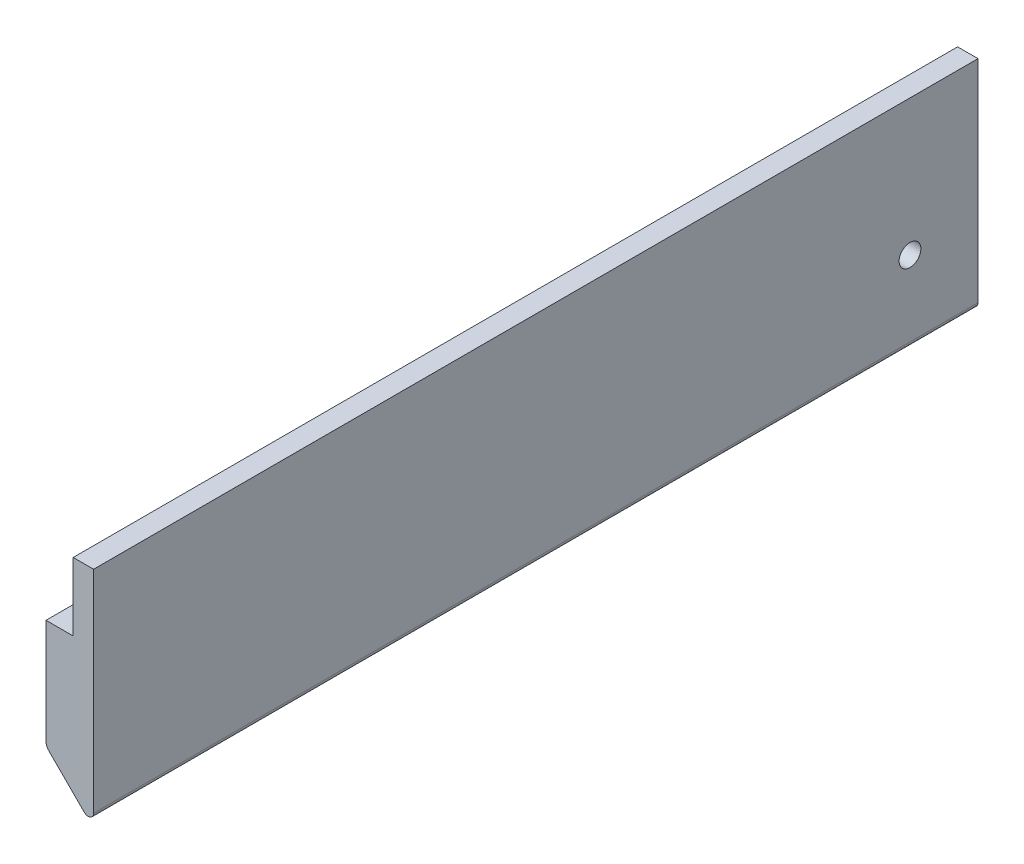
ISO-10303-21;
HEADER;
FILE_DESCRIPTION(('STEP AP214'),'2;1');
FILE_NAME('part.step','',(''),(''),'','','');
FILE_SCHEMA(('AUTOMOTIVE_DESIGN { 1 0 10303 214 1 1 1 1 }'));
ENDSEC;
DATA;
#1=APPLICATION_CONTEXT('core data for automotive mechanical design processes');
#2=APPLICATION_PROTOCOL_DEFINITION('international standard','automotive_design',2000,#1);
#3=PRODUCT_CONTEXT('',#1,'mechanical');
#4=PRODUCT('Part','Part','',(#3));
#5=PRODUCT_RELATED_PRODUCT_CATEGORY('part','',(#4));
#6=PRODUCT_DEFINITION_FORMATION('','',#4);
#7=PRODUCT_DEFINITION_CONTEXT('part definition',#1,'design');
#8=PRODUCT_DEFINITION('design','',#6,#7);
#9=PRODUCT_DEFINITION_SHAPE('','',#8);
#10=(LENGTH_UNIT() NAMED_UNIT(*) SI_UNIT(.MILLI.,.METRE.));
#11=(NAMED_UNIT(*) PLANE_ANGLE_UNIT() SI_UNIT($,.RADIAN.));
#12=(NAMED_UNIT(*) SI_UNIT($,.STERADIAN.) SOLID_ANGLE_UNIT());
#13=UNCERTAINTY_MEASURE_WITH_UNIT(LENGTH_MEASURE(1.E-05),#10,'distance_accuracy_value','');
#14=(GEOMETRIC_REPRESENTATION_CONTEXT(3) GLOBAL_UNCERTAINTY_ASSIGNED_CONTEXT((#13)) GLOBAL_UNIT_ASSIGNED_CONTEXT((#10,
#11,#12)) REPRESENTATION_CONTEXT('',''));
#15=CARTESIAN_POINT('',(0.,0.,0.));
#16=DIRECTION('',(0.,0.,1.));
#17=DIRECTION('',(1.,0.,0.));
#18=AXIS2_PLACEMENT_3D('',#15,#16,#17);
#19=CARTESIAN_POINT('',(-7.01000000000001,30.,150.));
#20=DIRECTION('',(0.,0.,1.));
#21=DIRECTION('',(1.,0.,0.));
#22=AXIS2_PLACEMENT_3D('',#19,#20,#21);
#23=PLANE('',#22);
#24=CARTESIAN_POINT('',(-0.8,-1.06862915010153,150.));
#25=DIRECTION('',(0.,0.,1.));
#26=DIRECTION('',(1.,0.,0.));
#27=AXIS2_PLACEMENT_3D('',#24,#25,#26);
#28=CIRCLE('',#27,0.8);
#29=CARTESIAN_POINT('',(0.,-1.06862915010152,150.));
#30=VERTEX_POINT('',#29);
#31=CARTESIAN_POINT('',(-1.36568542494924,-1.63431457505076,150.));
#32=VERTEX_POINT('',#31);
#33=EDGE_CURVE('E155',#30,#32,#28,.F.);
#34=ORIENTED_EDGE('',*,*,#33,.F.);
#35=DIRECTION('',(0.,-1.,0.));
#36=VECTOR('',#35,1.);
#37=CARTESIAN_POINT('',(0.,0.,150.));
#38=LINE('',#37,#36);
#39=CARTESIAN_POINT('',(0.,30.,150.));
#40=VERTEX_POINT('',#39);
#41=EDGE_CURVE('E162',#40,#30,#38,.T.);
#42=ORIENTED_EDGE('',*,*,#41,.F.);
#43=DIRECTION('',(1.,0.,0.));
#44=VECTOR('',#43,1.);
#45=CARTESIAN_POINT('',(0.,30.,150.));
#46=LINE('',#45,#44);
#47=CARTESIAN_POINT('',(-3.,30.,150.));
#48=VERTEX_POINT('',#47);
#49=EDGE_CURVE('E117',#48,#40,#46,.T.);
#50=ORIENTED_EDGE('',*,*,#49,.F.);
#51=DIRECTION('',(0.,1.,0.));
#52=VECTOR('',#51,1.);
#53=CARTESIAN_POINT('',(-3.,20.,150.));
#54=LINE('',#53,#52);
#55=CARTESIAN_POINT('',(-3.,20.,150.));
#56=VERTEX_POINT('',#55);
#57=EDGE_CURVE('E107',#56,#48,#54,.T.);
#58=ORIENTED_EDGE('',*,*,#57,.F.);
#59=DIRECTION('',(-1.,0.,0.));
#60=VECTOR('',#59,1.);
#61=CARTESIAN_POINT('',(-7.,20.,150.));
#62=LINE('',#61,#60);
#63=CARTESIAN_POINT('',(-7.,20.,150.));
#64=VERTEX_POINT('',#63);
#65=EDGE_CURVE('E115',#56,#64,#62,.T.);
#66=ORIENTED_EDGE('',*,*,#65,.T.);
#67=DIRECTION('',(0.,1.,0.));
#68=VECTOR('',#67,1.);
#69=CARTESIAN_POINT('',(-7.,7.,150.));
#70=LINE('',#69,#68);
#71=CARTESIAN_POINT('',(-7.,4.62132034355964,150.));
#72=VERTEX_POINT('',#71);
#73=EDGE_CURVE('E118',#72,#64,#70,.T.);
#74=ORIENTED_EDGE('',*,*,#73,.F.);
#75=CARTESIAN_POINT('',(-5.5,4.62132034355964,150.));
#76=DIRECTION('',(0.,0.,1.));
#77=DIRECTION('',(1.,0.,0.));
#78=AXIS2_PLACEMENT_3D('',#75,#76,#77);
#79=CIRCLE('',#78,1.5);
#80=CARTESIAN_POINT('',(-6.56066017177982,3.56066017177982,150.));
#81=VERTEX_POINT('',#80);
#82=EDGE_CURVE('E157',#81,#72,#79,.F.);
#83=ORIENTED_EDGE('',*,*,#82,.F.);
#84=DIRECTION('',(-0.707106781186548,0.707106781186548,0.));
#85=VECTOR('',#84,1.);
#86=CARTESIAN_POINT('',(-7.,4.,150.));
#87=LINE('',#86,#85);
#88=EDGE_CURVE('E159',#32,#81,#87,.T.);
#89=ORIENTED_EDGE('',*,*,#88,.F.);
#90=EDGE_LOOP('',(#34,#42,#50,#58,#66,#74,#83,#89));
#91=FACE_BOUND('',#90,.T.);
#92=ADVANCED_FACE('F41',(#91),#23,.T.);
#93=CARTESIAN_POINT('',(-3.,20.,20.));
#94=DIRECTION('',(-1.,0.,0.));
#95=DIRECTION('',(0.,0.,1.));
#96=AXIS2_PLACEMENT_3D('',#93,#94,#95);
#97=PLANE('',#96);
#98=DIRECTION('',(0.,0.,-1.));
#99=VECTOR('',#98,1.);
#100=CARTESIAN_POINT('',(-3.,20.,280.));
#101=LINE('',#100,#99);
#102=CARTESIAN_POINT('',(-3.,20.,20.));
#103=VERTEX_POINT('',#102);
#104=EDGE_CURVE('E45',#56,#103,#101,.T.);
#105=ORIENTED_EDGE('',*,*,#104,.F.);
#106=ORIENTED_EDGE('',*,*,#57,.T.);
#107=DIRECTION('',(0.,0.,1.));
#108=VECTOR('',#107,1.);
#109=CARTESIAN_POINT('',(-3.,30.,20.));
#110=LINE('',#109,#108);
#111=CARTESIAN_POINT('',(-3.,30.,20.));
#112=VERTEX_POINT('',#111);
#113=EDGE_CURVE('E139',#112,#48,#110,.T.);
#114=ORIENTED_EDGE('',*,*,#113,.F.);
#115=DIRECTION('',(0.,-1.,0.));
#116=VECTOR('',#115,1.);
#117=CARTESIAN_POINT('',(-3.,20.,20.));
#118=LINE('',#117,#116);
#119=EDGE_CURVE('E109',#112,#103,#118,.T.);
#120=ORIENTED_EDGE('',*,*,#119,.T.);
#121=EDGE_LOOP('',(#105,#106,#114,#120));
#122=FACE_BOUND('',#121,.T.);
#123=ADVANCED_FACE('F105',(#122),#97,.T.);
#124=CARTESIAN_POINT('',(-7.,7.,20.));
#125=DIRECTION('',(-1.,0.,0.));
#126=DIRECTION('',(0.,0.,1.));
#127=AXIS2_PLACEMENT_3D('',#124,#125,#126);
#128=PLANE('',#127);
#129=CARTESIAN_POINT('',(-7.,10.,30.));
#130=DIRECTION('',(-1.,0.,0.));
#131=DIRECTION('',(0.,0.,1.));
#132=AXIS2_PLACEMENT_3D('',#129,#130,#131);
#133=CIRCLE('',#132,3.36);
#134=CARTESIAN_POINT('',(-7.,10.,33.36));
#135=VERTEX_POINT('',#134);
#136=EDGE_CURVE('E11',#135,#135,#133,.T.);
#137=ORIENTED_EDGE('',*,*,#136,.F.);
#138=EDGE_LOOP('',(#137));
#139=FACE_BOUND('',#138,.T.);
#140=DIRECTION('',(0.,0.,1.));
#141=VECTOR('',#140,1.);
#142=CARTESIAN_POINT('',(-7.,4.62132034355964,20.));
#143=LINE('',#142,#141);
#144=CARTESIAN_POINT('',(-7.,4.62132034355964,20.));
#145=VERTEX_POINT('',#144);
#146=EDGE_CURVE('E134',#145,#72,#143,.T.);
#147=ORIENTED_EDGE('',*,*,#146,.T.);
#148=ORIENTED_EDGE('',*,*,#73,.T.);
#149=DIRECTION('',(0.,0.,-1.));
#150=VECTOR('',#149,1.);
#151=CARTESIAN_POINT('',(-7.,20.,280.));
#152=LINE('',#151,#150);
#153=CARTESIAN_POINT('',(-7.,20.,20.));
#154=VERTEX_POINT('',#153);
#155=EDGE_CURVE('E111',#64,#154,#152,.T.);
#156=ORIENTED_EDGE('',*,*,#155,.T.);
#157=DIRECTION('',(0.,-1.,0.));
#158=VECTOR('',#157,1.);
#159=CARTESIAN_POINT('',(-7.,7.,20.));
#160=LINE('',#159,#158);
#161=EDGE_CURVE('E183',#154,#145,#160,.T.);
#162=ORIENTED_EDGE('',*,*,#161,.T.);
#163=EDGE_LOOP('',(#147,#148,#156,#162));
#164=FACE_BOUND('',#163,.T.);
#165=ADVANCED_FACE('F164',(#139,#164),#128,.T.);
#166=CARTESIAN_POINT('',(0.,0.,20.));
#167=DIRECTION('',(1.,0.,0.));
#168=DIRECTION('',(0.,1.,0.));
#169=AXIS2_PLACEMENT_3D('',#166,#167,#168);
#170=PLANE('',#169);
#171=CARTESIAN_POINT('',(0.,10.,30.));
#172=DIRECTION('',(-1.,0.,0.));
#173=DIRECTION('',(0.,0.,1.));
#174=AXIS2_PLACEMENT_3D('',#171,#172,#173);
#175=CIRCLE('',#174,1.6);
#176=CARTESIAN_POINT('',(0.,10.,31.6));
#177=VERTEX_POINT('',#176);
#178=EDGE_CURVE('E110',#177,#177,#175,.T.);
#179=ORIENTED_EDGE('',*,*,#178,.T.);
#180=EDGE_LOOP('',(#179));
#181=FACE_BOUND('',#180,.T.);
#182=DIRECTION('',(0.,0.,-1.));
#183=VECTOR('',#182,1.);
#184=CARTESIAN_POINT('',(0.,30.,280.));
#185=LINE('',#184,#183);
#186=CARTESIAN_POINT('',(0.,30.,20.));
#187=VERTEX_POINT('',#186);
#188=EDGE_CURVE('E137',#40,#187,#185,.T.);
#189=ORIENTED_EDGE('',*,*,#188,.F.);
#190=ORIENTED_EDGE('',*,*,#41,.T.);
#191=DIRECTION('',(0.,0.,-1.));
#192=VECTOR('',#191,1.);
#193=CARTESIAN_POINT('',(0.,-1.06862915010152,20.));
#194=LINE('',#193,#192);
#195=CARTESIAN_POINT('',(0.,-1.06862915010152,20.));
#196=VERTEX_POINT('',#195);
#197=EDGE_CURVE('E129',#30,#196,#194,.T.);
#198=ORIENTED_EDGE('',*,*,#197,.T.);
#199=DIRECTION('',(0.,1.,0.));
#200=VECTOR('',#199,1.);
#201=CARTESIAN_POINT('',(0.,0.,20.));
#202=LINE('',#201,#200);
#203=EDGE_CURVE('E179',#196,#187,#202,.T.);
#204=ORIENTED_EDGE('',*,*,#203,.T.);
#205=EDGE_LOOP('',(#189,#190,#198,#204));
#206=FACE_BOUND('',#205,.T.);
#207=ADVANCED_FACE('F193',(#181,#206),#170,.T.);
#208=CARTESIAN_POINT('',(-7.,4.,20.));
#209=DIRECTION('',(-0.707106781186548,-0.707106781186548,0.));
#210=DIRECTION('',(0.707106781186548,-0.707106781186548,0.));
#211=AXIS2_PLACEMENT_3D('',#208,#209,#210);
#212=PLANE('',#211);
#213=DIRECTION('',(0.,0.,-1.));
#214=VECTOR('',#213,1.);
#215=CARTESIAN_POINT('',(-1.36568542494924,-1.63431457505076,20.));
#216=LINE('',#215,#214);
#217=CARTESIAN_POINT('',(-1.36568542494924,-1.63431457505076,20.));
#218=VERTEX_POINT('',#217);
#219=EDGE_CURVE('E125',#218,#32,#216,.F.);
#220=ORIENTED_EDGE('',*,*,#219,.T.);
#221=ORIENTED_EDGE('',*,*,#88,.T.);
#222=DIRECTION('',(0.,0.,1.));
#223=VECTOR('',#222,1.);
#224=CARTESIAN_POINT('',(-6.56066017177982,3.56066017177982,20.));
#225=LINE('',#224,#223);
#226=CARTESIAN_POINT('',(-6.56066017177982,3.56066017177982,20.));
#227=VERTEX_POINT('',#226);
#228=EDGE_CURVE('E132',#81,#227,#225,.F.);
#229=ORIENTED_EDGE('',*,*,#228,.T.);
#230=DIRECTION('',(0.707106781186548,-0.707106781186548,0.));
#231=VECTOR('',#230,1.);
#232=CARTESIAN_POINT('',(-7.,4.,20.));
#233=LINE('',#232,#231);
#234=EDGE_CURVE('E182',#227,#218,#233,.T.);
#235=ORIENTED_EDGE('',*,*,#234,.T.);
#236=EDGE_LOOP('',(#220,#221,#229,#235));
#237=FACE_BOUND('',#236,.T.);
#238=ADVANCED_FACE('F170',(#237),#212,.T.);
#239=CARTESIAN_POINT('',(-5.5,4.62132034355964,20.));
#240=DIRECTION('',(0.,0.,1.));
#241=DIRECTION('',(1.,0.,0.));
#242=AXIS2_PLACEMENT_3D('',#239,#240,#241);
#243=CYLINDRICAL_SURFACE('',#242,1.5);
#244=ORIENTED_EDGE('',*,*,#228,.F.);
#245=ORIENTED_EDGE('',*,*,#82,.T.);
#246=ORIENTED_EDGE('',*,*,#146,.F.);
#247=CARTESIAN_POINT('',(-5.5,4.62132034355964,20.));
#248=DIRECTION('',(0.,0.,1.));
#249=DIRECTION('',(1.,0.,0.));
#250=AXIS2_PLACEMENT_3D('',#247,#248,#249);
#251=CIRCLE('',#250,1.5);
#252=EDGE_CURVE('E131',#227,#145,#251,.F.);
#253=ORIENTED_EDGE('',*,*,#252,.F.);
#254=EDGE_LOOP('',(#244,#245,#246,#253));
#255=FACE_BOUND('',#254,.T.);
#256=ADVANCED_FACE('F43',(#255),#243,.T.);
#257=CARTESIAN_POINT('',(-0.8,-1.06862915010153,20.));
#258=DIRECTION('',(0.,0.,-1.));
#259=DIRECTION('',(-1.,0.,0.));
#260=AXIS2_PLACEMENT_3D('',#257,#258,#259);
#261=CYLINDRICAL_SURFACE('',#260,0.8);
#262=ORIENTED_EDGE('',*,*,#197,.F.);
#263=ORIENTED_EDGE('',*,*,#33,.T.);
#264=ORIENTED_EDGE('',*,*,#219,.F.);
#265=CARTESIAN_POINT('',(-0.8,-1.06862915010153,20.));
#266=DIRECTION('',(0.,0.,1.));
#267=DIRECTION('',(1.,0.,0.));
#268=AXIS2_PLACEMENT_3D('',#265,#266,#267);
#269=CIRCLE('',#268,0.8);
#270=EDGE_CURVE('E128',#196,#218,#269,.F.);
#271=ORIENTED_EDGE('',*,*,#270,.F.);
#272=EDGE_LOOP('',(#262,#263,#264,#271));
#273=FACE_BOUND('',#272,.T.);
#274=ADVANCED_FACE('F196',(#273),#261,.T.);
#275=CARTESIAN_POINT('',(0.,30.,0.));
#276=DIRECTION('',(0.,1.,0.));
#277=DIRECTION('',(0.,0.,1.));
#278=AXIS2_PLACEMENT_3D('',#275,#276,#277);
#279=PLANE('',#278);
#280=ORIENTED_EDGE('',*,*,#113,.T.);
#281=ORIENTED_EDGE('',*,*,#49,.T.);
#282=ORIENTED_EDGE('',*,*,#188,.T.);
#283=DIRECTION('',(-1.,0.,0.));
#284=VECTOR('',#283,1.);
#285=CARTESIAN_POINT('',(0.,30.,20.));
#286=LINE('',#285,#284);
#287=EDGE_CURVE('E140',#187,#112,#286,.T.);
#288=ORIENTED_EDGE('',*,*,#287,.T.);
#289=EDGE_LOOP('',(#280,#281,#282,#288));
#290=FACE_BOUND('',#289,.T.);
#291=ADVANCED_FACE('F187',(#290),#279,.T.);
#292=CARTESIAN_POINT('',(-7.,20.,280.));
#293=DIRECTION('',(0.,-1.,0.));
#294=DIRECTION('',(0.,0.,-1.));
#295=AXIS2_PLACEMENT_3D('',#292,#293,#294);
#296=PLANE('',#295);
#297=ORIENTED_EDGE('',*,*,#65,.F.);
#298=ORIENTED_EDGE('',*,*,#104,.T.);
#299=DIRECTION('',(1.,0.,0.));
#300=VECTOR('',#299,1.);
#301=CARTESIAN_POINT('',(-7.,20.,20.));
#302=LINE('',#301,#300);
#303=EDGE_CURVE('E141',#154,#103,#302,.T.);
#304=ORIENTED_EDGE('',*,*,#303,.F.);
#305=ORIENTED_EDGE('',*,*,#155,.F.);
#306=EDGE_LOOP('',(#297,#298,#304,#305));
#307=FACE_BOUND('',#306,.T.);
#308=ADVANCED_FACE('F120',(#307),#296,.F.);
#309=CARTESIAN_POINT('',(0.,0.,20.));
#310=DIRECTION('',(0.,0.,1.));
#311=DIRECTION('',(1.,0.,0.));
#312=AXIS2_PLACEMENT_3D('',#309,#310,#311);
#313=PLANE('',#312);
#314=ORIENTED_EDGE('',*,*,#161,.F.);
#315=ORIENTED_EDGE('',*,*,#303,.T.);
#316=ORIENTED_EDGE('',*,*,#119,.F.);
#317=ORIENTED_EDGE('',*,*,#287,.F.);
#318=ORIENTED_EDGE('',*,*,#203,.F.);
#319=ORIENTED_EDGE('',*,*,#270,.T.);
#320=ORIENTED_EDGE('',*,*,#234,.F.);
#321=ORIENTED_EDGE('',*,*,#252,.T.);
#322=EDGE_LOOP('',(#314,#315,#316,#317,#318,#319,#320,#321));
#323=FACE_BOUND('',#322,.T.);
#324=ADVANCED_FACE('F190',(#323),#313,.F.);
#325=CARTESIAN_POINT('',(-7.,10.,30.));
#326=DIRECTION('',(-1.,0.,0.));
#327=DIRECTION('',(0.,0.,1.));
#328=AXIS2_PLACEMENT_3D('',#325,#326,#327);
#329=CYLINDRICAL_SURFACE('',#328,1.59999999999999);
#330=ORIENTED_EDGE('',*,*,#178,.F.);
#331=EDGE_LOOP('',(#330));
#332=FACE_BOUND('',#331,.T.);
#333=CARTESIAN_POINT('',(-5.23999999999999,10.,30.));
#334=DIRECTION('',(-1.,0.,0.));
#335=DIRECTION('',(0.,0.,1.));
#336=AXIS2_PLACEMENT_3D('',#333,#334,#335);
#337=CIRCLE('',#336,1.59999999999999);
#338=CARTESIAN_POINT('',(-5.23999999999999,10.,31.6));
#339=VERTEX_POINT('',#338);
#340=EDGE_CURVE('E51',#339,#339,#337,.T.);
#341=ORIENTED_EDGE('',*,*,#340,.T.);
#342=EDGE_LOOP('',(#341));
#343=FACE_BOUND('',#342,.T.);
#344=ADVANCED_FACE('F219',(#332,#343),#329,.F.);
#345=CARTESIAN_POINT('',(-7.,10.,30.));
#346=DIRECTION('',(-1.,0.,0.));
#347=DIRECTION('',(0.,0.,1.));
#348=AXIS2_PLACEMENT_3D('',#345,#346,#347);
#349=CONICAL_SURFACE('',#348,3.36,0.785398163397448);
#350=ORIENTED_EDGE('',*,*,#340,.F.);
#351=EDGE_LOOP('',(#350));
#352=FACE_BOUND('',#351,.T.);
#353=ORIENTED_EDGE('',*,*,#136,.T.);
#354=EDGE_LOOP('',(#353));
#355=FACE_BOUND('',#354,.T.);
#356=ADVANCED_FACE('F212',(#352,#355),#349,.F.);
#357=CLOSED_SHELL('',(#92,#123,#165,#207,#238,#256,#274,#291,#308,#324,#344,#356));
#358=MANIFOLD_SOLID_BREP('B2',#357);
#359=ADVANCED_BREP_SHAPE_REPRESENTATION('',(#18,#358),#14);
#360=SHAPE_DEFINITION_REPRESENTATION(#9,#359);
ENDSEC;
END-ISO-10303-21;
